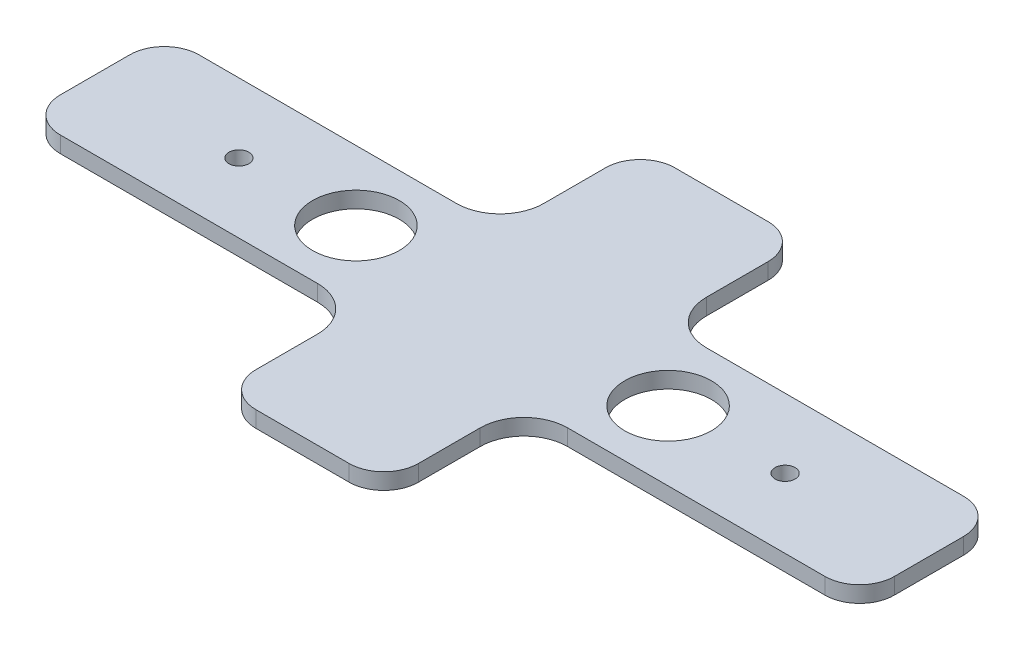
ISO-10303-21;
HEADER;
FILE_DESCRIPTION(('STEP AP214'),'2;1');
FILE_NAME('part.step','',(''),(''),'','','');
FILE_SCHEMA(('AUTOMOTIVE_DESIGN { 1 0 10303 214 1 1 1 1 }'));
ENDSEC;
DATA;
#1=APPLICATION_CONTEXT('core data for automotive mechanical design processes');
#2=APPLICATION_PROTOCOL_DEFINITION('international standard','automotive_design',2000,#1);
#3=PRODUCT_CONTEXT('',#1,'mechanical');
#4=PRODUCT('Part','Part','',(#3));
#5=PRODUCT_RELATED_PRODUCT_CATEGORY('part','',(#4));
#6=PRODUCT_DEFINITION_FORMATION('','',#4);
#7=PRODUCT_DEFINITION_CONTEXT('part definition',#1,'design');
#8=PRODUCT_DEFINITION('design','',#6,#7);
#9=PRODUCT_DEFINITION_SHAPE('','',#8);
#10=(LENGTH_UNIT() NAMED_UNIT(*) SI_UNIT(.MILLI.,.METRE.));
#11=(NAMED_UNIT(*) PLANE_ANGLE_UNIT() SI_UNIT($,.RADIAN.));
#12=(NAMED_UNIT(*) SI_UNIT($,.STERADIAN.) SOLID_ANGLE_UNIT());
#13=UNCERTAINTY_MEASURE_WITH_UNIT(LENGTH_MEASURE(1.E-05),#10,'distance_accuracy_value','');
#14=(GEOMETRIC_REPRESENTATION_CONTEXT(3) GLOBAL_UNCERTAINTY_ASSIGNED_CONTEXT((#13)) GLOBAL_UNIT_ASSIGNED_CONTEXT((#10,
#11,#12)) REPRESENTATION_CONTEXT('',''));
#15=CARTESIAN_POINT('',(0.,0.,0.));
#16=DIRECTION('',(0.,0.,1.));
#17=DIRECTION('',(1.,0.,0.));
#18=AXIS2_PLACEMENT_3D('',#15,#16,#17);
#19=CARTESIAN_POINT('',(0.,90.5002,143.155943707725));
#20=DIRECTION('',(0.,0.,1.));
#21=DIRECTION('',(1.,0.,0.));
#22=AXIS2_PLACEMENT_3D('',#19,#20,#21);
#23=PLANE('',#22);
#24=DIRECTION('',(1.,0.,0.));
#25=VECTOR('',#24,1.);
#26=CARTESIAN_POINT('',(0.,93.472,143.155943707725));
#27=LINE('',#26,#25);
#28=CARTESIAN_POINT('',(-9.32304003720227,93.472,143.155943707725));
#29=VERTEX_POINT('',#28);
#30=CARTESIAN_POINT('',(7.73150051393097,93.472,143.155943707725));
#31=VERTEX_POINT('',#30);
#32=EDGE_CURVE('E275',#29,#31,#27,.T.);
#33=ORIENTED_EDGE('',*,*,#32,.T.);
#34=DIRECTION('',(0.,1.,0.));
#35=VECTOR('',#34,1.);
#36=CARTESIAN_POINT('',(7.73150051393097,90.5002,143.155943707725));
#37=LINE('',#36,#35);
#38=CARTESIAN_POINT('',(7.73150051393097,90.5002,143.155943707725));
#39=VERTEX_POINT('',#38);
#40=EDGE_CURVE('E213',#39,#31,#37,.T.);
#41=ORIENTED_EDGE('',*,*,#40,.F.);
#42=DIRECTION('',(1.,0.,0.));
#43=VECTOR('',#42,1.);
#44=CARTESIAN_POINT('',(0.,90.5002,143.155943707725));
#45=LINE('',#44,#43);
#46=CARTESIAN_POINT('',(-9.32304003720227,90.5002,143.155943707725));
#47=VERTEX_POINT('',#46);
#48=EDGE_CURVE('E212',#47,#39,#45,.T.);
#49=ORIENTED_EDGE('',*,*,#48,.F.);
#50=DIRECTION('',(0.,1.,0.));
#51=VECTOR('',#50,1.);
#52=CARTESIAN_POINT('',(-9.32304003720227,90.5002,143.155943707725));
#53=LINE('',#52,#51);
#54=EDGE_CURVE('E197',#47,#29,#53,.T.);
#55=ORIENTED_EDGE('',*,*,#54,.T.);
#56=EDGE_LOOP('',(#33,#41,#49,#55));
#57=FACE_BOUND('',#56,.T.);
#58=ADVANCED_FACE('F36',(#57),#23,.F.);
#59=CARTESIAN_POINT('',(7.73150051393097,90.5002,149.505943707725));
#60=DIRECTION('',(0.,1.,0.));
#61=DIRECTION('',(0.,0.,1.));
#62=AXIS2_PLACEMENT_3D('',#59,#60,#61);
#63=CYLINDRICAL_SURFACE('',#62,6.35);
#64=CARTESIAN_POINT('',(7.73150051393097,93.472,149.505943707725));
#65=DIRECTION('',(0.,1.,0.));
#66=DIRECTION('',(0.,0.,1.));
#67=AXIS2_PLACEMENT_3D('',#64,#65,#66);
#68=CIRCLE('',#67,6.35);
#69=CARTESIAN_POINT('',(14.081500513931,93.472,149.505943707725));
#70=VERTEX_POINT('',#69);
#71=EDGE_CURVE('E321',#70,#31,#68,.T.);
#72=ORIENTED_EDGE('',*,*,#71,.F.);
#73=DIRECTION('',(0.,1.,0.));
#74=VECTOR('',#73,1.);
#75=CARTESIAN_POINT('',(14.081500513931,90.5002,149.505943707725));
#76=LINE('',#75,#74);
#77=CARTESIAN_POINT('',(14.081500513931,90.5002,149.505943707725));
#78=VERTEX_POINT('',#77);
#79=EDGE_CURVE('E327',#78,#70,#76,.T.);
#80=ORIENTED_EDGE('',*,*,#79,.F.);
#81=CARTESIAN_POINT('',(7.73150051393097,90.5002,149.505943707725));
#82=DIRECTION('',(0.,1.,0.));
#83=DIRECTION('',(0.,0.,1.));
#84=AXIS2_PLACEMENT_3D('',#81,#82,#83);
#85=CIRCLE('',#84,6.35);
#86=EDGE_CURVE('E209',#78,#39,#85,.T.);
#87=ORIENTED_EDGE('',*,*,#86,.T.);
#88=ORIENTED_EDGE('',*,*,#40,.T.);
#89=EDGE_LOOP('',(#72,#80,#87,#88));
#90=FACE_BOUND('',#89,.T.);
#91=ADVANCED_FACE('F437',(#90),#63,.T.);
#92=CARTESIAN_POINT('',(14.081500513931,90.5002,0.));
#93=DIRECTION('',(-1.,0.,0.));
#94=DIRECTION('',(0.,0.,1.));
#95=AXIS2_PLACEMENT_3D('',#92,#93,#94);
#96=PLANE('',#95);
#97=DIRECTION('',(0.,0.,1.));
#98=VECTOR('',#97,1.);
#99=CARTESIAN_POINT('',(14.081500513931,93.472,0.));
#100=LINE('',#99,#98);
#101=CARTESIAN_POINT('',(14.081500513931,93.472,160.805943707725));
#102=VERTEX_POINT('',#101);
#103=EDGE_CURVE('E318',#70,#102,#100,.T.);
#104=ORIENTED_EDGE('',*,*,#103,.T.);
#105=DIRECTION('',(0.,1.,0.));
#106=VECTOR('',#105,1.);
#107=CARTESIAN_POINT('',(14.081500513931,90.5002,160.805943707725));
#108=LINE('',#107,#106);
#109=CARTESIAN_POINT('',(14.081500513931,90.5002,160.805943707725));
#110=VERTEX_POINT('',#109);
#111=EDGE_CURVE('E367',#102,#110,#108,.F.);
#112=ORIENTED_EDGE('',*,*,#111,.T.);
#113=DIRECTION('',(0.,0.,1.));
#114=VECTOR('',#113,1.);
#115=CARTESIAN_POINT('',(14.081500513931,90.5002,0.));
#116=LINE('',#115,#114);
#117=EDGE_CURVE('E264',#78,#110,#116,.T.);
#118=ORIENTED_EDGE('',*,*,#117,.F.);
#119=ORIENTED_EDGE('',*,*,#79,.T.);
#120=EDGE_LOOP('',(#104,#112,#118,#119));
#121=FACE_BOUND('',#120,.T.);
#122=ADVANCED_FACE('F432',(#121),#96,.F.);
#123=CARTESIAN_POINT('',(0.,90.5002,168.805943707725));
#124=DIRECTION('',(0.,0.,1.));
#125=DIRECTION('',(1.,0.,0.));
#126=AXIS2_PLACEMENT_3D('',#123,#124,#125);
#127=PLANE('',#126);
#128=DIRECTION('',(1.,0.,0.));
#129=VECTOR('',#128,1.);
#130=CARTESIAN_POINT('',(0.,90.5002,168.805943707725));
#131=LINE('',#130,#129);
#132=CARTESIAN_POINT('',(22.081500513931,90.5002,168.805943707725));
#133=VERTEX_POINT('',#132);
#134=CARTESIAN_POINT('',(69.2042302383644,90.5002,168.805943707725));
#135=VERTEX_POINT('',#134);
#136=EDGE_CURVE('E262',#133,#135,#131,.T.);
#137=ORIENTED_EDGE('',*,*,#136,.F.);
#138=DIRECTION('',(0.,1.,0.));
#139=VECTOR('',#138,1.);
#140=CARTESIAN_POINT('',(22.081500513931,93.472,168.805943707725));
#141=LINE('',#140,#139);
#142=CARTESIAN_POINT('',(22.081500513931,93.472,168.805943707725));
#143=VERTEX_POINT('',#142);
#144=EDGE_CURVE('E364',#133,#143,#141,.T.);
#145=ORIENTED_EDGE('',*,*,#144,.T.);
#146=DIRECTION('',(1.,0.,0.));
#147=VECTOR('',#146,1.);
#148=CARTESIAN_POINT('',(0.,93.472,168.805943707725));
#149=LINE('',#148,#147);
#150=CARTESIAN_POINT('',(69.2042302383644,93.472,168.805943707725));
#151=VERTEX_POINT('',#150);
#152=EDGE_CURVE('E316',#143,#151,#149,.T.);
#153=ORIENTED_EDGE('',*,*,#152,.T.);
#154=DIRECTION('',(0.,1.,0.));
#155=VECTOR('',#154,1.);
#156=CARTESIAN_POINT('',(69.2042302383644,90.5002,168.805943707725));
#157=LINE('',#156,#155);
#158=EDGE_CURVE('E329',#135,#151,#157,.T.);
#159=ORIENTED_EDGE('',*,*,#158,.F.);
#160=EDGE_LOOP('',(#137,#145,#153,#159));
#161=FACE_BOUND('',#160,.T.);
#162=ADVANCED_FACE('F425',(#161),#127,.F.);
#163=CARTESIAN_POINT('',(69.2042302383644,90.5002,175.155943707725));
#164=DIRECTION('',(0.,1.,0.));
#165=DIRECTION('',(0.,0.,1.));
#166=AXIS2_PLACEMENT_3D('',#163,#164,#165);
#167=CYLINDRICAL_SURFACE('',#166,6.34999999999999);
#168=CARTESIAN_POINT('',(69.2042302383644,93.472,175.155943707725));
#169=DIRECTION('',(0.,1.,0.));
#170=DIRECTION('',(0.,0.,1.));
#171=AXIS2_PLACEMENT_3D('',#168,#169,#170);
#172=CIRCLE('',#171,6.34999999999999);
#173=CARTESIAN_POINT('',(75.5542302383644,93.472,175.155943707725));
#174=VERTEX_POINT('',#173);
#175=EDGE_CURVE('E314',#151,#174,#172,.F.);
#176=ORIENTED_EDGE('',*,*,#175,.T.);
#177=DIRECTION('',(0.,1.,0.));
#178=VECTOR('',#177,1.);
#179=CARTESIAN_POINT('',(75.5542302383644,90.5002,175.155943707725));
#180=LINE('',#179,#178);
#181=CARTESIAN_POINT('',(75.5542302383644,90.5002,175.155943707725));
#182=VERTEX_POINT('',#181);
#183=EDGE_CURVE('E332',#182,#174,#180,.T.);
#184=ORIENTED_EDGE('',*,*,#183,.F.);
#185=CARTESIAN_POINT('',(69.2042302383644,90.5002,175.155943707725));
#186=DIRECTION('',(0.,1.,0.));
#187=DIRECTION('',(0.,0.,1.));
#188=AXIS2_PLACEMENT_3D('',#185,#186,#187);
#189=CIRCLE('',#188,6.34999999999999);
#190=EDGE_CURVE('E260',#135,#182,#189,.F.);
#191=ORIENTED_EDGE('',*,*,#190,.F.);
#192=ORIENTED_EDGE('',*,*,#158,.T.);
#193=EDGE_LOOP('',(#176,#184,#191,#192));
#194=FACE_BOUND('',#193,.T.);
#195=ADVANCED_FACE('F421',(#194),#167,.T.);
#196=CARTESIAN_POINT('',(75.5542302383646,90.5002,0.));
#197=DIRECTION('',(-1.,0.,0.));
#198=DIRECTION('',(0.,0.,1.));
#199=AXIS2_PLACEMENT_3D('',#196,#197,#198);
#200=PLANE('',#199);
#201=DIRECTION('',(0.,0.,1.));
#202=VECTOR('',#201,1.);
#203=CARTESIAN_POINT('',(75.5542302383646,93.472,0.));
#204=LINE('',#203,#202);
#205=CARTESIAN_POINT('',(75.5542302383644,93.472,187.855943707725));
#206=VERTEX_POINT('',#205);
#207=EDGE_CURVE('E312',#174,#206,#204,.T.);
#208=ORIENTED_EDGE('',*,*,#207,.T.);
#209=DIRECTION('',(0.,1.,0.));
#210=VECTOR('',#209,1.);
#211=CARTESIAN_POINT('',(75.5542302383644,90.5002,187.855943707725));
#212=LINE('',#211,#210);
#213=CARTESIAN_POINT('',(75.5542302383644,90.5002,187.855943707725));
#214=VERTEX_POINT('',#213);
#215=EDGE_CURVE('E335',#214,#206,#212,.T.);
#216=ORIENTED_EDGE('',*,*,#215,.F.);
#217=DIRECTION('',(0.,0.,1.));
#218=VECTOR('',#217,1.);
#219=CARTESIAN_POINT('',(75.5542302383646,90.5002,0.));
#220=LINE('',#219,#218);
#221=EDGE_CURVE('E258',#182,#214,#220,.T.);
#222=ORIENTED_EDGE('',*,*,#221,.F.);
#223=ORIENTED_EDGE('',*,*,#183,.T.);
#224=EDGE_LOOP('',(#208,#216,#222,#223));
#225=FACE_BOUND('',#224,.T.);
#226=ADVANCED_FACE('F416',(#225),#200,.F.);
#227=CARTESIAN_POINT('',(69.2042302383644,90.5002,187.855943707725));
#228=DIRECTION('',(0.,1.,0.));
#229=DIRECTION('',(0.,0.,1.));
#230=AXIS2_PLACEMENT_3D('',#227,#228,#229);
#231=CYLINDRICAL_SURFACE('',#230,6.34999999999999);
#232=CARTESIAN_POINT('',(69.2042302383644,93.472,187.855943707725));
#233=DIRECTION('',(0.,1.,0.));
#234=DIRECTION('',(0.,0.,1.));
#235=AXIS2_PLACEMENT_3D('',#232,#233,#234);
#236=CIRCLE('',#235,6.34999999999999);
#237=CARTESIAN_POINT('',(69.2042302383644,93.472,194.205943707725));
#238=VERTEX_POINT('',#237);
#239=EDGE_CURVE('E310',#206,#238,#236,.F.);
#240=ORIENTED_EDGE('',*,*,#239,.T.);
#241=DIRECTION('',(0.,1.,0.));
#242=VECTOR('',#241,1.);
#243=CARTESIAN_POINT('',(69.2042302383644,90.5002,194.205943707725));
#244=LINE('',#243,#242);
#245=CARTESIAN_POINT('',(69.2042302383644,90.5002,194.205943707725));
#246=VERTEX_POINT('',#245);
#247=EDGE_CURVE('E338',#246,#238,#244,.T.);
#248=ORIENTED_EDGE('',*,*,#247,.F.);
#249=CARTESIAN_POINT('',(69.2042302383644,90.5002,187.855943707725));
#250=DIRECTION('',(0.,1.,0.));
#251=DIRECTION('',(0.,0.,1.));
#252=AXIS2_PLACEMENT_3D('',#249,#250,#251);
#253=CIRCLE('',#252,6.34999999999999);
#254=EDGE_CURVE('E256',#214,#246,#253,.F.);
#255=ORIENTED_EDGE('',*,*,#254,.F.);
#256=ORIENTED_EDGE('',*,*,#215,.T.);
#257=EDGE_LOOP('',(#240,#248,#255,#256));
#258=FACE_BOUND('',#257,.T.);
#259=ADVANCED_FACE('F410',(#258),#231,.T.);
#260=CARTESIAN_POINT('',(0.,90.5002,194.205943707725));
#261=DIRECTION('',(0.,0.,-1.));
#262=DIRECTION('',(-1.,0.,0.));
#263=AXIS2_PLACEMENT_3D('',#260,#261,#262);
#264=PLANE('',#263);
#265=DIRECTION('',(-1.,0.,0.));
#266=VECTOR('',#265,1.);
#267=CARTESIAN_POINT('',(0.,93.472,194.205943707725));
#268=LINE('',#267,#266);
#269=CARTESIAN_POINT('',(22.081500513931,93.472,194.205943707725));
#270=VERTEX_POINT('',#269);
#271=EDGE_CURVE('E307',#238,#270,#268,.T.);
#272=ORIENTED_EDGE('',*,*,#271,.T.);
#273=DIRECTION('',(0.,1.,0.));
#274=VECTOR('',#273,1.);
#275=CARTESIAN_POINT('',(22.081500513931,90.5002,194.205943707725));
#276=LINE('',#275,#274);
#277=CARTESIAN_POINT('',(22.081500513931,90.5002,194.205943707725));
#278=VERTEX_POINT('',#277);
#279=EDGE_CURVE('E372',#270,#278,#276,.F.);
#280=ORIENTED_EDGE('',*,*,#279,.T.);
#281=DIRECTION('',(-1.,0.,0.));
#282=VECTOR('',#281,1.);
#283=CARTESIAN_POINT('',(0.,90.5002,194.205943707725));
#284=LINE('',#283,#282);
#285=EDGE_CURVE('E253',#246,#278,#284,.T.);
#286=ORIENTED_EDGE('',*,*,#285,.F.);
#287=ORIENTED_EDGE('',*,*,#247,.T.);
#288=EDGE_LOOP('',(#272,#280,#286,#287));
#289=FACE_BOUND('',#288,.T.);
#290=ADVANCED_FACE('F406',(#289),#264,.F.);
#291=CARTESIAN_POINT('',(14.0815005139309,90.5002,0.));
#292=DIRECTION('',(-1.,0.,0.));
#293=DIRECTION('',(0.,0.,1.));
#294=AXIS2_PLACEMENT_3D('',#291,#292,#293);
#295=PLANE('',#294);
#296=DIRECTION('',(0.,0.,1.));
#297=VECTOR('',#296,1.);
#298=CARTESIAN_POINT('',(14.0815005139309,90.5002,0.));
#299=LINE('',#298,#297);
#300=CARTESIAN_POINT('',(14.081500513931,90.5002,202.205943707725));
#301=VERTEX_POINT('',#300);
#302=CARTESIAN_POINT('',(14.081500513931,90.5002,213.505943707725));
#303=VERTEX_POINT('',#302);
#304=EDGE_CURVE('E251',#301,#303,#299,.T.);
#305=ORIENTED_EDGE('',*,*,#304,.F.);
#306=DIRECTION('',(0.,1.,0.));
#307=VECTOR('',#306,1.);
#308=CARTESIAN_POINT('',(14.081500513931,93.472,202.205943707725));
#309=LINE('',#308,#307);
#310=CARTESIAN_POINT('',(14.081500513931,93.472,202.205943707725));
#311=VERTEX_POINT('',#310);
#312=EDGE_CURVE('E369',#301,#311,#309,.T.);
#313=ORIENTED_EDGE('',*,*,#312,.T.);
#314=DIRECTION('',(0.,0.,1.));
#315=VECTOR('',#314,1.);
#316=CARTESIAN_POINT('',(14.0815005139309,93.472,0.));
#317=LINE('',#316,#315);
#318=CARTESIAN_POINT('',(14.081500513931,93.472,213.505943707725));
#319=VERTEX_POINT('',#318);
#320=EDGE_CURVE('E305',#311,#319,#317,.T.);
#321=ORIENTED_EDGE('',*,*,#320,.T.);
#322=DIRECTION('',(0.,1.,0.));
#323=VECTOR('',#322,1.);
#324=CARTESIAN_POINT('',(14.081500513931,90.5002,213.505943707725));
#325=LINE('',#324,#323);
#326=EDGE_CURVE('E341',#303,#319,#325,.T.);
#327=ORIENTED_EDGE('',*,*,#326,.F.);
#328=EDGE_LOOP('',(#305,#313,#321,#327));
#329=FACE_BOUND('',#328,.T.);
#330=ADVANCED_FACE('F397',(#329),#295,.F.);
#331=CARTESIAN_POINT('',(7.73150051393097,90.5002,213.505943707725));
#332=DIRECTION('',(0.,1.,0.));
#333=DIRECTION('',(0.,0.,1.));
#334=AXIS2_PLACEMENT_3D('',#331,#332,#333);
#335=CYLINDRICAL_SURFACE('',#334,6.35);
#336=CARTESIAN_POINT('',(7.73150051393097,93.472,213.505943707725));
#337=DIRECTION('',(0.,1.,0.));
#338=DIRECTION('',(0.,0.,1.));
#339=AXIS2_PLACEMENT_3D('',#336,#337,#338);
#340=CIRCLE('',#339,6.35);
#341=CARTESIAN_POINT('',(7.73150051393097,93.472,219.855943707725));
#342=VERTEX_POINT('',#341);
#343=EDGE_CURVE('E302',#319,#342,#340,.F.);
#344=ORIENTED_EDGE('',*,*,#343,.T.);
#345=DIRECTION('',(0.,1.,0.));
#346=VECTOR('',#345,1.);
#347=CARTESIAN_POINT('',(7.73150051393097,90.5002,219.855943707725));
#348=LINE('',#347,#346);
#349=CARTESIAN_POINT('',(7.73150051393097,90.5002,219.855943707725));
#350=VERTEX_POINT('',#349);
#351=EDGE_CURVE('E344',#350,#342,#348,.T.);
#352=ORIENTED_EDGE('',*,*,#351,.F.);
#353=CARTESIAN_POINT('',(7.73150051393097,90.5002,213.505943707725));
#354=DIRECTION('',(0.,1.,0.));
#355=DIRECTION('',(0.,0.,1.));
#356=AXIS2_PLACEMENT_3D('',#353,#354,#355);
#357=CIRCLE('',#356,6.35);
#358=EDGE_CURVE('E249',#303,#350,#357,.F.);
#359=ORIENTED_EDGE('',*,*,#358,.F.);
#360=ORIENTED_EDGE('',*,*,#326,.T.);
#361=EDGE_LOOP('',(#344,#352,#359,#360));
#362=FACE_BOUND('',#361,.T.);
#363=ADVANCED_FACE('F480',(#362),#335,.T.);
#364=CARTESIAN_POINT('',(0.,90.5002,219.855943707725));
#365=DIRECTION('',(0.,0.,1.));
#366=DIRECTION('',(1.,0.,0.));
#367=AXIS2_PLACEMENT_3D('',#364,#365,#366);
#368=PLANE('',#367);
#369=DIRECTION('',(1.,0.,0.));
#370=VECTOR('',#369,1.);
#371=CARTESIAN_POINT('',(0.,93.472,219.855943707725));
#372=LINE('',#371,#370);
#373=CARTESIAN_POINT('',(-9.32304003720227,93.472,219.855943707725));
#374=VERTEX_POINT('',#373);
#375=EDGE_CURVE('E299',#374,#342,#372,.T.);
#376=ORIENTED_EDGE('',*,*,#375,.F.);
#377=DIRECTION('',(0.,1.,0.));
#378=VECTOR('',#377,1.);
#379=CARTESIAN_POINT('',(-9.32304003720227,90.5002,219.855943707725));
#380=LINE('',#379,#378);
#381=CARTESIAN_POINT('',(-9.32304003720227,90.5002,219.855943707725));
#382=VERTEX_POINT('',#381);
#383=EDGE_CURVE('E346',#382,#374,#380,.T.);
#384=ORIENTED_EDGE('',*,*,#383,.F.);
#385=DIRECTION('',(1.,0.,0.));
#386=VECTOR('',#385,1.);
#387=CARTESIAN_POINT('',(0.,90.5002,219.855943707725));
#388=LINE('',#387,#386);
#389=EDGE_CURVE('E246',#382,#350,#388,.T.);
#390=ORIENTED_EDGE('',*,*,#389,.T.);
#391=ORIENTED_EDGE('',*,*,#351,.T.);
#392=EDGE_LOOP('',(#376,#384,#390,#391));
#393=FACE_BOUND('',#392,.T.);
#394=ADVANCED_FACE('F477',(#393),#368,.T.);
#395=CARTESIAN_POINT('',(-9.32304003720227,90.5002,213.505943707725));
#396=DIRECTION('',(0.,1.,0.));
#397=DIRECTION('',(0.,0.,1.));
#398=AXIS2_PLACEMENT_3D('',#395,#396,#397);
#399=CYLINDRICAL_SURFACE('',#398,6.35);
#400=CARTESIAN_POINT('',(-9.32304003720227,93.472,213.505943707725));
#401=DIRECTION('',(0.,1.,0.));
#402=DIRECTION('',(0.,0.,1.));
#403=AXIS2_PLACEMENT_3D('',#400,#401,#402);
#404=CIRCLE('',#403,6.35);
#405=CARTESIAN_POINT('',(-15.6730400372023,93.472,213.505943707725));
#406=VERTEX_POINT('',#405);
#407=EDGE_CURVE('E296',#406,#374,#404,.T.);
#408=ORIENTED_EDGE('',*,*,#407,.F.);
#409=DIRECTION('',(0.,1.,0.));
#410=VECTOR('',#409,1.);
#411=CARTESIAN_POINT('',(-15.6730400372023,90.5002,213.505943707725));
#412=LINE('',#411,#410);
#413=CARTESIAN_POINT('',(-15.6730400372023,90.5002,213.505943707725));
#414=VERTEX_POINT('',#413);
#415=EDGE_CURVE('E348',#414,#406,#412,.T.);
#416=ORIENTED_EDGE('',*,*,#415,.F.);
#417=CARTESIAN_POINT('',(-9.32304003720227,90.5002,213.505943707725));
#418=DIRECTION('',(0.,1.,0.));
#419=DIRECTION('',(0.,0.,1.));
#420=AXIS2_PLACEMENT_3D('',#417,#418,#419);
#421=CIRCLE('',#420,6.35);
#422=EDGE_CURVE('E243',#414,#382,#421,.T.);
#423=ORIENTED_EDGE('',*,*,#422,.T.);
#424=ORIENTED_EDGE('',*,*,#383,.T.);
#425=EDGE_LOOP('',(#408,#416,#423,#424));
#426=FACE_BOUND('',#425,.T.);
#427=ADVANCED_FACE('F474',(#426),#399,.T.);
#428=CARTESIAN_POINT('',(-15.6730400372023,90.5002,0.));
#429=DIRECTION('',(1.,0.,0.));
#430=DIRECTION('',(0.,0.,-1.));
#431=AXIS2_PLACEMENT_3D('',#428,#429,#430);
#432=PLANE('',#431);
#433=DIRECTION('',(0.,0.,-1.));
#434=VECTOR('',#433,1.);
#435=CARTESIAN_POINT('',(-15.6730400372023,93.472,0.));
#436=LINE('',#435,#434);
#437=CARTESIAN_POINT('',(-15.6730400372023,93.472,202.205943707725));
#438=VERTEX_POINT('',#437);
#439=EDGE_CURVE('E294',#406,#438,#436,.T.);
#440=ORIENTED_EDGE('',*,*,#439,.T.);
#441=DIRECTION('',(0.,1.,0.));
#442=VECTOR('',#441,1.);
#443=CARTESIAN_POINT('',(-15.6730400372023,90.5002,202.205943707725));
#444=LINE('',#443,#442);
#445=CARTESIAN_POINT('',(-15.6730400372023,90.5002,202.205943707725));
#446=VERTEX_POINT('',#445);
#447=EDGE_CURVE('E51',#438,#446,#444,.F.);
#448=ORIENTED_EDGE('',*,*,#447,.T.);
#449=DIRECTION('',(0.,0.,-1.));
#450=VECTOR('',#449,1.);
#451=CARTESIAN_POINT('',(-15.6730400372023,90.5002,0.));
#452=LINE('',#451,#450);
#453=EDGE_CURVE('E241',#414,#446,#452,.T.);
#454=ORIENTED_EDGE('',*,*,#453,.F.);
#455=ORIENTED_EDGE('',*,*,#415,.T.);
#456=EDGE_LOOP('',(#440,#448,#454,#455));
#457=FACE_BOUND('',#456,.T.);
#458=ADVANCED_FACE('F471',(#457),#432,.F.);
#459=CARTESIAN_POINT('',(0.,90.5002,194.205943707725));
#460=DIRECTION('',(0.,0.,-1.));
#461=DIRECTION('',(-1.,0.,0.));
#462=AXIS2_PLACEMENT_3D('',#459,#460,#461);
#463=PLANE('',#462);
#464=DIRECTION('',(-1.,0.,0.));
#465=VECTOR('',#464,1.);
#466=CARTESIAN_POINT('',(0.,90.5002,194.205943707725));
#467=LINE('',#466,#465);
#468=CARTESIAN_POINT('',(-23.6730400372023,90.5002,194.205943707725));
#469=VERTEX_POINT('',#468);
#470=CARTESIAN_POINT('',(-70.7957697616356,90.5002,194.205943707725));
#471=VERTEX_POINT('',#470);
#472=EDGE_CURVE('E239',#469,#471,#467,.T.);
#473=ORIENTED_EDGE('',*,*,#472,.F.);
#474=DIRECTION('',(0.,1.,0.));
#475=VECTOR('',#474,1.);
#476=CARTESIAN_POINT('',(-23.6730400372023,93.472,194.205943707725));
#477=LINE('',#476,#475);
#478=CARTESIAN_POINT('',(-23.6730400372023,93.472,194.205943707725));
#479=VERTEX_POINT('',#478);
#480=EDGE_CURVE('E374',#469,#479,#477,.T.);
#481=ORIENTED_EDGE('',*,*,#480,.T.);
#482=DIRECTION('',(-1.,0.,0.));
#483=VECTOR('',#482,1.);
#484=CARTESIAN_POINT('',(0.,93.472,194.205943707725));
#485=LINE('',#484,#483);
#486=CARTESIAN_POINT('',(-70.7957697616356,93.472,194.205943707725));
#487=VERTEX_POINT('',#486);
#488=EDGE_CURVE('E292',#479,#487,#485,.T.);
#489=ORIENTED_EDGE('',*,*,#488,.T.);
#490=DIRECTION('',(0.,1.,0.));
#491=VECTOR('',#490,1.);
#492=CARTESIAN_POINT('',(-70.7957697616356,90.5002,194.205943707725));
#493=LINE('',#492,#491);
#494=EDGE_CURVE('E350',#471,#487,#493,.T.);
#495=ORIENTED_EDGE('',*,*,#494,.F.);
#496=EDGE_LOOP('',(#473,#481,#489,#495));
#497=FACE_BOUND('',#496,.T.);
#498=ADVANCED_FACE('F465',(#497),#463,.F.);
#499=CARTESIAN_POINT('',(-70.7957697616356,90.5002,187.855943707725));
#500=DIRECTION('',(0.,1.,0.));
#501=DIRECTION('',(0.,0.,1.));
#502=AXIS2_PLACEMENT_3D('',#499,#500,#501);
#503=CYLINDRICAL_SURFACE('',#502,6.34999999999999);
#504=CARTESIAN_POINT('',(-70.7957697616356,93.472,187.855943707725));
#505=DIRECTION('',(0.,1.,0.));
#506=DIRECTION('',(0.,0.,1.));
#507=AXIS2_PLACEMENT_3D('',#504,#505,#506);
#508=CIRCLE('',#507,6.34999999999999);
#509=CARTESIAN_POINT('',(-77.1457697616356,93.472,187.855943707725));
#510=VERTEX_POINT('',#509);
#511=EDGE_CURVE('E289',#510,#487,#508,.T.);
#512=ORIENTED_EDGE('',*,*,#511,.F.);
#513=DIRECTION('',(0.,1.,0.));
#514=VECTOR('',#513,1.);
#515=CARTESIAN_POINT('',(-77.1457697616356,90.5002,187.855943707725));
#516=LINE('',#515,#514);
#517=CARTESIAN_POINT('',(-77.1457697616356,90.5002,187.855943707725));
#518=VERTEX_POINT('',#517);
#519=EDGE_CURVE('E353',#518,#510,#516,.T.);
#520=ORIENTED_EDGE('',*,*,#519,.F.);
#521=CARTESIAN_POINT('',(-70.7957697616356,90.5002,187.855943707725));
#522=DIRECTION('',(0.,1.,0.));
#523=DIRECTION('',(0.,0.,1.));
#524=AXIS2_PLACEMENT_3D('',#521,#522,#523);
#525=CIRCLE('',#524,6.34999999999999);
#526=EDGE_CURVE('E236',#518,#471,#525,.T.);
#527=ORIENTED_EDGE('',*,*,#526,.T.);
#528=ORIENTED_EDGE('',*,*,#494,.T.);
#529=EDGE_LOOP('',(#512,#520,#527,#528));
#530=FACE_BOUND('',#529,.T.);
#531=ADVANCED_FACE('F461',(#530),#503,.T.);
#532=CARTESIAN_POINT('',(-77.1457697616356,90.5002,0.));
#533=DIRECTION('',(-1.,0.,0.));
#534=DIRECTION('',(0.,0.,1.));
#535=AXIS2_PLACEMENT_3D('',#532,#533,#534);
#536=PLANE('',#535);
#537=DIRECTION('',(0.,0.,1.));
#538=VECTOR('',#537,1.);
#539=CARTESIAN_POINT('',(-77.1457697616356,93.472,0.));
#540=LINE('',#539,#538);
#541=CARTESIAN_POINT('',(-77.1457697616356,93.472,175.155943707725));
#542=VERTEX_POINT('',#541);
#543=EDGE_CURVE('E286',#542,#510,#540,.T.);
#544=ORIENTED_EDGE('',*,*,#543,.F.);
#545=DIRECTION('',(0.,1.,0.));
#546=VECTOR('',#545,1.);
#547=CARTESIAN_POINT('',(-77.1457697616356,90.5002,175.155943707725));
#548=LINE('',#547,#546);
#549=CARTESIAN_POINT('',(-77.1457697616356,90.5002,175.155943707725));
#550=VERTEX_POINT('',#549);
#551=EDGE_CURVE('E355',#550,#542,#548,.T.);
#552=ORIENTED_EDGE('',*,*,#551,.F.);
#553=DIRECTION('',(0.,0.,1.));
#554=VECTOR('',#553,1.);
#555=CARTESIAN_POINT('',(-77.1457697616356,90.5002,0.));
#556=LINE('',#555,#554);
#557=EDGE_CURVE('E233',#550,#518,#556,.T.);
#558=ORIENTED_EDGE('',*,*,#557,.T.);
#559=ORIENTED_EDGE('',*,*,#519,.T.);
#560=EDGE_LOOP('',(#544,#552,#558,#559));
#561=FACE_BOUND('',#560,.T.);
#562=ADVANCED_FACE('F459',(#561),#536,.T.);
#563=CARTESIAN_POINT('',(-70.7957697616356,90.5002,175.155943707725));
#564=DIRECTION('',(0.,1.,0.));
#565=DIRECTION('',(0.,0.,1.));
#566=AXIS2_PLACEMENT_3D('',#563,#564,#565);
#567=CYLINDRICAL_SURFACE('',#566,6.34999999999999);
#568=CARTESIAN_POINT('',(-70.7957697616356,93.472,175.155943707725));
#569=DIRECTION('',(0.,1.,0.));
#570=DIRECTION('',(0.,0.,1.));
#571=AXIS2_PLACEMENT_3D('',#568,#569,#570);
#572=CIRCLE('',#571,6.34999999999999);
#573=CARTESIAN_POINT('',(-70.7957697616356,93.472,168.805943707725));
#574=VERTEX_POINT('',#573);
#575=EDGE_CURVE('E283',#574,#542,#572,.T.);
#576=ORIENTED_EDGE('',*,*,#575,.F.);
#577=DIRECTION('',(0.,1.,0.));
#578=VECTOR('',#577,1.);
#579=CARTESIAN_POINT('',(-70.7957697616356,90.5002,168.805943707725));
#580=LINE('',#579,#578);
#581=CARTESIAN_POINT('',(-70.7957697616356,90.5002,168.805943707725));
#582=VERTEX_POINT('',#581);
#583=EDGE_CURVE('E357',#582,#574,#580,.T.);
#584=ORIENTED_EDGE('',*,*,#583,.F.);
#585=CARTESIAN_POINT('',(-70.7957697616356,90.5002,175.155943707725));
#586=DIRECTION('',(0.,1.,0.));
#587=DIRECTION('',(0.,0.,1.));
#588=AXIS2_PLACEMENT_3D('',#585,#586,#587);
#589=CIRCLE('',#588,6.34999999999999);
#590=EDGE_CURVE('E230',#582,#550,#589,.T.);
#591=ORIENTED_EDGE('',*,*,#590,.T.);
#592=ORIENTED_EDGE('',*,*,#551,.T.);
#593=EDGE_LOOP('',(#576,#584,#591,#592));
#594=FACE_BOUND('',#593,.T.);
#595=ADVANCED_FACE('F455',(#594),#567,.T.);
#596=CARTESIAN_POINT('',(0.,90.5002,168.805943707725));
#597=DIRECTION('',(0.,0.,1.));
#598=DIRECTION('',(1.,0.,0.));
#599=AXIS2_PLACEMENT_3D('',#596,#597,#598);
#600=PLANE('',#599);
#601=DIRECTION('',(1.,0.,0.));
#602=VECTOR('',#601,1.);
#603=CARTESIAN_POINT('',(0.,93.472,168.805943707725));
#604=LINE('',#603,#602);
#605=CARTESIAN_POINT('',(-23.6730400372023,93.472,168.805943707725));
#606=VERTEX_POINT('',#605);
#607=EDGE_CURVE('E280',#574,#606,#604,.T.);
#608=ORIENTED_EDGE('',*,*,#607,.T.);
#609=DIRECTION('',(0.,1.,0.));
#610=VECTOR('',#609,1.);
#611=CARTESIAN_POINT('',(-23.6730400372023,90.5002,168.805943707725));
#612=LINE('',#611,#610);
#613=CARTESIAN_POINT('',(-23.6730400372023,90.5002,168.805943707725));
#614=VERTEX_POINT('',#613);
#615=EDGE_CURVE('E362',#606,#614,#612,.F.);
#616=ORIENTED_EDGE('',*,*,#615,.T.);
#617=DIRECTION('',(1.,0.,0.));
#618=VECTOR('',#617,1.);
#619=CARTESIAN_POINT('',(0.,90.5002,168.805943707725));
#620=LINE('',#619,#618);
#621=EDGE_CURVE('E224',#582,#614,#620,.T.);
#622=ORIENTED_EDGE('',*,*,#621,.F.);
#623=ORIENTED_EDGE('',*,*,#583,.T.);
#624=EDGE_LOOP('',(#608,#616,#622,#623));
#625=FACE_BOUND('',#624,.T.);
#626=ADVANCED_FACE('F449',(#625),#600,.F.);
#627=CARTESIAN_POINT('',(-15.6730400372023,90.5002,0.));
#628=DIRECTION('',(1.,0.,0.));
#629=DIRECTION('',(0.,0.,-1.));
#630=AXIS2_PLACEMENT_3D('',#627,#628,#629);
#631=PLANE('',#630);
#632=DIRECTION('',(0.,0.,-1.));
#633=VECTOR('',#632,1.);
#634=CARTESIAN_POINT('',(-15.6730400372023,90.5002,0.));
#635=LINE('',#634,#633);
#636=CARTESIAN_POINT('',(-15.6730400372023,90.5002,160.805943707725));
#637=VERTEX_POINT('',#636);
#638=CARTESIAN_POINT('',(-15.6730400372023,90.5002,149.505943707725));
#639=VERTEX_POINT('',#638);
#640=EDGE_CURVE('E221',#637,#639,#635,.T.);
#641=ORIENTED_EDGE('',*,*,#640,.F.);
#642=DIRECTION('',(0.,1.,0.));
#643=VECTOR('',#642,1.);
#644=CARTESIAN_POINT('',(-15.6730400372023,93.472,160.805943707725));
#645=LINE('',#644,#643);
#646=CARTESIAN_POINT('',(-15.6730400372023,93.472,160.805943707725));
#647=VERTEX_POINT('',#646);
#648=EDGE_CURVE('E326',#637,#647,#645,.T.);
#649=ORIENTED_EDGE('',*,*,#648,.T.);
#650=DIRECTION('',(0.,0.,-1.));
#651=VECTOR('',#650,1.);
#652=CARTESIAN_POINT('',(-15.6730400372023,93.472,0.));
#653=LINE('',#652,#651);
#654=CARTESIAN_POINT('',(-15.6730400372023,93.472,149.505943707725));
#655=VERTEX_POINT('',#654);
#656=EDGE_CURVE('E278',#647,#655,#653,.T.);
#657=ORIENTED_EDGE('',*,*,#656,.T.);
#658=DIRECTION('',(0.,1.,0.));
#659=VECTOR('',#658,1.);
#660=CARTESIAN_POINT('',(-15.6730400372023,90.5002,149.505943707725));
#661=LINE('',#660,#659);
#662=EDGE_CURVE('E208',#639,#655,#661,.T.);
#663=ORIENTED_EDGE('',*,*,#662,.F.);
#664=EDGE_LOOP('',(#641,#649,#657,#663));
#665=FACE_BOUND('',#664,.T.);
#666=ADVANCED_FACE('F441',(#665),#631,.F.);
#667=CARTESIAN_POINT('',(-29.3707697616357,90.5002,181.505943707726));
#668=DIRECTION('',(0.,1.,0.));
#669=DIRECTION('',(0.,0.,1.));
#670=AXIS2_PLACEMENT_3D('',#667,#668,#669);
#671=CYLINDRICAL_SURFACE('',#670,7.93749999999996);
#672=CARTESIAN_POINT('',(-29.3707697616357,90.5002,181.505943707726));
#673=DIRECTION('',(0.,1.,0.));
#674=DIRECTION('',(0.,0.,1.));
#675=AXIS2_PLACEMENT_3D('',#672,#673,#674);
#676=CIRCLE('',#675,7.93749999999996);
#677=CARTESIAN_POINT('',(-29.3707697616357,90.5002,189.443443707726));
#678=VERTEX_POINT('',#677);
#679=EDGE_CURVE('E217',#678,#678,#676,.T.);
#680=ORIENTED_EDGE('',*,*,#679,.F.);
#681=EDGE_LOOP('',(#680));
#682=FACE_BOUND('',#681,.T.);
#683=CARTESIAN_POINT('',(-29.3707697616357,93.472,181.505943707726));
#684=DIRECTION('',(0.,1.,0.));
#685=DIRECTION('',(0.,0.,1.));
#686=AXIS2_PLACEMENT_3D('',#683,#684,#685);
#687=CIRCLE('',#686,7.93749999999996);
#688=CARTESIAN_POINT('',(-29.3707697616357,93.472,189.443443707726));
#689=VERTEX_POINT('',#688);
#690=EDGE_CURVE('E271',#689,#689,#687,.T.);
#691=ORIENTED_EDGE('',*,*,#690,.T.);
#692=EDGE_LOOP('',(#691));
#693=FACE_BOUND('',#692,.T.);
#694=ADVANCED_FACE('F498',(#682,#693),#671,.F.);
#695=CARTESIAN_POINT('',(27.7792302383642,90.5002,181.505943707726));
#696=DIRECTION('',(0.,1.,0.));
#697=DIRECTION('',(0.,0.,1.));
#698=AXIS2_PLACEMENT_3D('',#695,#696,#697);
#699=CYLINDRICAL_SURFACE('',#698,7.93750000000001);
#700=CARTESIAN_POINT('',(27.7792302383642,90.5002,181.505943707726));
#701=DIRECTION('',(0.,1.,0.));
#702=DIRECTION('',(0.,0.,1.));
#703=AXIS2_PLACEMENT_3D('',#700,#701,#702);
#704=CIRCLE('',#703,7.93750000000001);
#705=CARTESIAN_POINT('',(27.7792302383642,90.5002,189.443443707726));
#706=VERTEX_POINT('',#705);
#707=EDGE_CURVE('E324',#706,#706,#704,.T.);
#708=ORIENTED_EDGE('',*,*,#707,.F.);
#709=EDGE_LOOP('',(#708));
#710=FACE_BOUND('',#709,.T.);
#711=CARTESIAN_POINT('',(27.7792302383642,93.472,181.505943707726));
#712=DIRECTION('',(0.,1.,0.));
#713=DIRECTION('',(0.,0.,1.));
#714=AXIS2_PLACEMENT_3D('',#711,#712,#713);
#715=CIRCLE('',#714,7.93750000000001);
#716=CARTESIAN_POINT('',(27.7792302383642,93.472,189.443443707726));
#717=VERTEX_POINT('',#716);
#718=EDGE_CURVE('E268',#717,#717,#715,.T.);
#719=ORIENTED_EDGE('',*,*,#718,.T.);
#720=EDGE_LOOP('',(#719));
#721=FACE_BOUND('',#720,.T.);
#722=ADVANCED_FACE('F501',(#710,#721),#699,.F.);
#723=CARTESIAN_POINT('',(-9.32304003720227,90.5002,149.505943707725));
#724=DIRECTION('',(0.,1.,0.));
#725=DIRECTION('',(0.,0.,1.));
#726=AXIS2_PLACEMENT_3D('',#723,#724,#725);
#727=CYLINDRICAL_SURFACE('',#726,6.35);
#728=CARTESIAN_POINT('',(-9.32304003720227,93.472,149.505943707725));
#729=DIRECTION('',(0.,1.,0.));
#730=DIRECTION('',(0.,0.,1.));
#731=AXIS2_PLACEMENT_3D('',#728,#729,#730);
#732=CIRCLE('',#731,6.35);
#733=EDGE_CURVE('E204',#29,#655,#732,.T.);
#734=ORIENTED_EDGE('',*,*,#733,.F.);
#735=ORIENTED_EDGE('',*,*,#54,.F.);
#736=CARTESIAN_POINT('',(-9.32304003720227,90.5002,149.505943707725));
#737=DIRECTION('',(0.,1.,0.));
#738=DIRECTION('',(0.,0.,1.));
#739=AXIS2_PLACEMENT_3D('',#736,#737,#738);
#740=CIRCLE('',#739,6.35);
#741=EDGE_CURVE('E202',#47,#639,#740,.T.);
#742=ORIENTED_EDGE('',*,*,#741,.T.);
#743=ORIENTED_EDGE('',*,*,#662,.T.);
#744=EDGE_LOOP('',(#734,#735,#742,#743));
#745=FACE_BOUND('',#744,.T.);
#746=ADVANCED_FACE('F199',(#745),#727,.T.);
#747=CARTESIAN_POINT('',(0.,90.5002,0.));
#748=DIRECTION('',(0.,1.,0.));
#749=DIRECTION('',(0.,0.,1.));
#750=AXIS2_PLACEMENT_3D('',#747,#748,#749);
#751=PLANE('',#750);
#752=CARTESIAN_POINT('',(49.2042302383644,90.5002,181.505943707725));
#753=DIRECTION('',(0.,1.,0.));
#754=DIRECTION('',(0.,0.,1.));
#755=AXIS2_PLACEMENT_3D('',#752,#753,#754);
#756=CIRCLE('',#755,1.8288);
#757=CARTESIAN_POINT('',(49.2042302383644,90.5002,183.334743707725));
#758=VERTEX_POINT('',#757);
#759=EDGE_CURVE('E272',#758,#758,#756,.T.);
#760=ORIENTED_EDGE('',*,*,#759,.T.);
#761=EDGE_LOOP('',(#760));
#762=FACE_BOUND('',#761,.T.);
#763=CARTESIAN_POINT('',(-50.7957697616357,90.5002,181.505943707725));
#764=DIRECTION('',(0.,1.,0.));
#765=DIRECTION('',(0.,0.,1.));
#766=AXIS2_PLACEMENT_3D('',#763,#764,#765);
#767=CIRCLE('',#766,1.8288);
#768=CARTESIAN_POINT('',(-50.7957697616357,90.5002,183.334743707725));
#769=VERTEX_POINT('',#768);
#770=EDGE_CURVE('E744',#769,#769,#767,.T.);
#771=ORIENTED_EDGE('',*,*,#770,.T.);
#772=EDGE_LOOP('',(#771));
#773=FACE_BOUND('',#772,.T.);
#774=ORIENTED_EDGE('',*,*,#707,.T.);
#775=EDGE_LOOP('',(#774));
#776=FACE_BOUND('',#775,.T.);
#777=ORIENTED_EDGE('',*,*,#679,.T.);
#778=EDGE_LOOP('',(#777));
#779=FACE_BOUND('',#778,.T.);
#780=ORIENTED_EDGE('',*,*,#48,.T.);
#781=ORIENTED_EDGE('',*,*,#86,.F.);
#782=ORIENTED_EDGE('',*,*,#117,.T.);
#783=CARTESIAN_POINT('',(22.081500513931,90.5002,160.805943707725));
#784=DIRECTION('',(0.,1.,0.));
#785=DIRECTION('',(0.,0.,1.));
#786=AXIS2_PLACEMENT_3D('',#783,#784,#785);
#787=CIRCLE('',#786,8.);
#788=EDGE_CURVE('E384',#110,#133,#787,.T.);
#789=ORIENTED_EDGE('',*,*,#788,.T.);
#790=ORIENTED_EDGE('',*,*,#136,.T.);
#791=ORIENTED_EDGE('',*,*,#190,.T.);
#792=ORIENTED_EDGE('',*,*,#221,.T.);
#793=ORIENTED_EDGE('',*,*,#254,.T.);
#794=ORIENTED_EDGE('',*,*,#285,.T.);
#795=CARTESIAN_POINT('',(22.081500513931,90.5002,202.205943707725));
#796=DIRECTION('',(0.,1.,0.));
#797=DIRECTION('',(0.,0.,1.));
#798=AXIS2_PLACEMENT_3D('',#795,#796,#797);
#799=CIRCLE('',#798,8.);
#800=EDGE_CURVE('E388',#278,#301,#799,.T.);
#801=ORIENTED_EDGE('',*,*,#800,.T.);
#802=ORIENTED_EDGE('',*,*,#304,.T.);
#803=ORIENTED_EDGE('',*,*,#358,.T.);
#804=ORIENTED_EDGE('',*,*,#389,.F.);
#805=ORIENTED_EDGE('',*,*,#422,.F.);
#806=ORIENTED_EDGE('',*,*,#453,.T.);
#807=CARTESIAN_POINT('',(-23.6730400372023,90.5002,202.205943707725));
#808=DIRECTION('',(0.,1.,0.));
#809=DIRECTION('',(0.,0.,1.));
#810=AXIS2_PLACEMENT_3D('',#807,#808,#809);
#811=CIRCLE('',#810,8.);
#812=EDGE_CURVE('E11',#446,#469,#811,.T.);
#813=ORIENTED_EDGE('',*,*,#812,.T.);
#814=ORIENTED_EDGE('',*,*,#472,.T.);
#815=ORIENTED_EDGE('',*,*,#526,.F.);
#816=ORIENTED_EDGE('',*,*,#557,.F.);
#817=ORIENTED_EDGE('',*,*,#590,.F.);
#818=ORIENTED_EDGE('',*,*,#621,.T.);
#819=CARTESIAN_POINT('',(-23.6730400372023,90.5002,160.805943707725));
#820=DIRECTION('',(0.,1.,0.));
#821=DIRECTION('',(0.,0.,1.));
#822=AXIS2_PLACEMENT_3D('',#819,#820,#821);
#823=CIRCLE('',#822,8.);
#824=EDGE_CURVE('E380',#614,#637,#823,.T.);
#825=ORIENTED_EDGE('',*,*,#824,.T.);
#826=ORIENTED_EDGE('',*,*,#640,.T.);
#827=ORIENTED_EDGE('',*,*,#741,.F.);
#828=EDGE_LOOP('',(#780,#781,#782,#789,#790,#791,#792,#793,#794,#801,#802,#803,#804,#805,#806,
#813,#814,#815,#816,#817,#818,#825,#826,#827));
#829=FACE_BOUND('',#828,.T.);
#830=ADVANCED_FACE('F219',(#762,#773,#776,#779,#829),#751,.F.);
#831=CARTESIAN_POINT('',(0.,93.472,0.));
#832=DIRECTION('',(0.,1.,0.));
#833=DIRECTION('',(0.,0.,1.));
#834=AXIS2_PLACEMENT_3D('',#831,#832,#833);
#835=PLANE('',#834);
#836=CARTESIAN_POINT('',(49.2042302383644,93.472,181.505943707725));
#837=DIRECTION('',(0.,1.,0.));
#838=DIRECTION('',(0.,0.,1.));
#839=AXIS2_PLACEMENT_3D('',#836,#837,#838);
#840=CIRCLE('',#839,1.8288);
#841=CARTESIAN_POINT('',(49.2042302383644,93.472,183.334743707725));
#842=VERTEX_POINT('',#841);
#843=EDGE_CURVE('E734',#842,#842,#840,.T.);
#844=ORIENTED_EDGE('',*,*,#843,.F.);
#845=EDGE_LOOP('',(#844));
#846=FACE_BOUND('',#845,.T.);
#847=CARTESIAN_POINT('',(-50.7957697616357,93.472,181.505943707725));
#848=DIRECTION('',(0.,1.,0.));
#849=DIRECTION('',(0.,0.,1.));
#850=AXIS2_PLACEMENT_3D('',#847,#848,#849);
#851=CIRCLE('',#850,1.8288);
#852=CARTESIAN_POINT('',(-50.7957697616357,93.472,183.334743707725));
#853=VERTEX_POINT('',#852);
#854=EDGE_CURVE('E737',#853,#853,#851,.T.);
#855=ORIENTED_EDGE('',*,*,#854,.F.);
#856=EDGE_LOOP('',(#855));
#857=FACE_BOUND('',#856,.T.);
#858=ORIENTED_EDGE('',*,*,#718,.F.);
#859=EDGE_LOOP('',(#858));
#860=FACE_BOUND('',#859,.T.);
#861=ORIENTED_EDGE('',*,*,#690,.F.);
#862=EDGE_LOOP('',(#861));
#863=FACE_BOUND('',#862,.T.);
#864=ORIENTED_EDGE('',*,*,#32,.F.);
#865=ORIENTED_EDGE('',*,*,#733,.T.);
#866=ORIENTED_EDGE('',*,*,#656,.F.);
#867=CARTESIAN_POINT('',(-23.6730400372023,93.472,160.805943707725));
#868=DIRECTION('',(0.,1.,0.));
#869=DIRECTION('',(0.,0.,1.));
#870=AXIS2_PLACEMENT_3D('',#867,#868,#869);
#871=CIRCLE('',#870,8.);
#872=EDGE_CURVE('E378',#647,#606,#871,.F.);
#873=ORIENTED_EDGE('',*,*,#872,.T.);
#874=ORIENTED_EDGE('',*,*,#607,.F.);
#875=ORIENTED_EDGE('',*,*,#575,.T.);
#876=ORIENTED_EDGE('',*,*,#543,.T.);
#877=ORIENTED_EDGE('',*,*,#511,.T.);
#878=ORIENTED_EDGE('',*,*,#488,.F.);
#879=CARTESIAN_POINT('',(-23.6730400372023,93.472,202.205943707725));
#880=DIRECTION('',(0.,1.,0.));
#881=DIRECTION('',(0.,0.,1.));
#882=AXIS2_PLACEMENT_3D('',#879,#880,#881);
#883=CIRCLE('',#882,8.);
#884=EDGE_CURVE('E44',#479,#438,#883,.F.);
#885=ORIENTED_EDGE('',*,*,#884,.T.);
#886=ORIENTED_EDGE('',*,*,#439,.F.);
#887=ORIENTED_EDGE('',*,*,#407,.T.);
#888=ORIENTED_EDGE('',*,*,#375,.T.);
#889=ORIENTED_EDGE('',*,*,#343,.F.);
#890=ORIENTED_EDGE('',*,*,#320,.F.);
#891=CARTESIAN_POINT('',(22.081500513931,93.472,202.205943707725));
#892=DIRECTION('',(0.,1.,0.));
#893=DIRECTION('',(0.,0.,1.));
#894=AXIS2_PLACEMENT_3D('',#891,#892,#893);
#895=CIRCLE('',#894,8.);
#896=EDGE_CURVE('E386',#311,#270,#895,.F.);
#897=ORIENTED_EDGE('',*,*,#896,.T.);
#898=ORIENTED_EDGE('',*,*,#271,.F.);
#899=ORIENTED_EDGE('',*,*,#239,.F.);
#900=ORIENTED_EDGE('',*,*,#207,.F.);
#901=ORIENTED_EDGE('',*,*,#175,.F.);
#902=ORIENTED_EDGE('',*,*,#152,.F.);
#903=CARTESIAN_POINT('',(22.081500513931,93.472,160.805943707725));
#904=DIRECTION('',(0.,1.,0.));
#905=DIRECTION('',(0.,0.,1.));
#906=AXIS2_PLACEMENT_3D('',#903,#904,#905);
#907=CIRCLE('',#906,8.);
#908=EDGE_CURVE('E382',#143,#102,#907,.F.);
#909=ORIENTED_EDGE('',*,*,#908,.T.);
#910=ORIENTED_EDGE('',*,*,#103,.F.);
#911=ORIENTED_EDGE('',*,*,#71,.T.);
#912=EDGE_LOOP('',(#864,#865,#866,#873,#874,#875,#876,#877,#878,#885,#886,#887,#888,#889,#890,
#897,#898,#899,#900,#901,#902,#909,#910,#911));
#913=FACE_BOUND('',#912,.T.);
#914=ADVANCED_FACE('F402',(#846,#857,#860,#863,#913),#835,.T.);
#915=CARTESIAN_POINT('',(-23.6730400372023,90.5002,160.805943707725));
#916=DIRECTION('',(0.,-1.,0.));
#917=DIRECTION('',(0.,0.,-1.));
#918=AXIS2_PLACEMENT_3D('',#915,#916,#917);
#919=CYLINDRICAL_SURFACE('',#918,8.);
#920=ORIENTED_EDGE('',*,*,#824,.F.);
#921=ORIENTED_EDGE('',*,*,#615,.F.);
#922=ORIENTED_EDGE('',*,*,#872,.F.);
#923=ORIENTED_EDGE('',*,*,#648,.F.);
#924=EDGE_LOOP('',(#920,#921,#922,#923));
#925=FACE_BOUND('',#924,.T.);
#926=ADVANCED_FACE('F445',(#925),#919,.F.);
#927=CARTESIAN_POINT('',(22.081500513931,90.5002,160.805943707725));
#928=DIRECTION('',(0.,-1.,0.));
#929=DIRECTION('',(0.,0.,-1.));
#930=AXIS2_PLACEMENT_3D('',#927,#928,#929);
#931=CYLINDRICAL_SURFACE('',#930,8.);
#932=ORIENTED_EDGE('',*,*,#788,.F.);
#933=ORIENTED_EDGE('',*,*,#111,.F.);
#934=ORIENTED_EDGE('',*,*,#908,.F.);
#935=ORIENTED_EDGE('',*,*,#144,.F.);
#936=EDGE_LOOP('',(#932,#933,#934,#935));
#937=FACE_BOUND('',#936,.T.);
#938=ADVANCED_FACE('F435',(#937),#931,.F.);
#939=CARTESIAN_POINT('',(22.081500513931,90.5002,202.205943707725));
#940=DIRECTION('',(0.,-1.,0.));
#941=DIRECTION('',(0.,0.,-1.));
#942=AXIS2_PLACEMENT_3D('',#939,#940,#941);
#943=CYLINDRICAL_SURFACE('',#942,8.);
#944=ORIENTED_EDGE('',*,*,#800,.F.);
#945=ORIENTED_EDGE('',*,*,#279,.F.);
#946=ORIENTED_EDGE('',*,*,#896,.F.);
#947=ORIENTED_EDGE('',*,*,#312,.F.);
#948=EDGE_LOOP('',(#944,#945,#946,#947));
#949=FACE_BOUND('',#948,.T.);
#950=ADVANCED_FACE('F400',(#949),#943,.F.);
#951=CARTESIAN_POINT('',(-23.6730400372023,90.5002,202.205943707725));
#952=DIRECTION('',(0.,-1.,0.));
#953=DIRECTION('',(0.,0.,-1.));
#954=AXIS2_PLACEMENT_3D('',#951,#952,#953);
#955=CYLINDRICAL_SURFACE('',#954,8.);
#956=ORIENTED_EDGE('',*,*,#812,.F.);
#957=ORIENTED_EDGE('',*,*,#447,.F.);
#958=ORIENTED_EDGE('',*,*,#884,.F.);
#959=ORIENTED_EDGE('',*,*,#480,.F.);
#960=EDGE_LOOP('',(#956,#957,#958,#959));
#961=FACE_BOUND('',#960,.T.);
#962=ADVANCED_FACE('F38',(#961),#955,.F.);
#963=CARTESIAN_POINT('',(-50.7957697616357,-226.06,181.505943707725));
#964=DIRECTION('',(0.,1.,0.));
#965=DIRECTION('',(0.,0.,1.));
#966=AXIS2_PLACEMENT_3D('',#963,#964,#965);
#967=CYLINDRICAL_SURFACE('',#966,1.8288);
#968=ORIENTED_EDGE('',*,*,#854,.T.);
#969=EDGE_LOOP('',(#968));
#970=FACE_BOUND('',#969,.T.);
#971=ORIENTED_EDGE('',*,*,#770,.F.);
#972=EDGE_LOOP('',(#971));
#973=FACE_BOUND('',#972,.T.);
#974=ADVANCED_FACE('F513',(#970,#973),#967,.F.);
#975=CARTESIAN_POINT('',(49.2042302383644,-226.06,181.505943707725));
#976=DIRECTION('',(0.,1.,0.));
#977=DIRECTION('',(0.,0.,1.));
#978=AXIS2_PLACEMENT_3D('',#975,#976,#977);
#979=CYLINDRICAL_SURFACE('',#978,1.8288);
#980=ORIENTED_EDGE('',*,*,#843,.T.);
#981=EDGE_LOOP('',(#980));
#982=FACE_BOUND('',#981,.T.);
#983=ORIENTED_EDGE('',*,*,#759,.F.);
#984=EDGE_LOOP('',(#983));
#985=FACE_BOUND('',#984,.T.);
#986=ADVANCED_FACE('F517',(#982,#985),#979,.F.);
#987=CLOSED_SHELL('',(#58,#91,#122,#162,#195,#226,#259,#290,#330,#363,#394,#427,#458,#498,#531,
#562,#595,#626,#666,#694,#722,#746,#830,#914,#926,#938,#950,#962,#974,#986));
#988=MANIFOLD_SOLID_BREP('B2',#987);
#989=ADVANCED_BREP_SHAPE_REPRESENTATION('',(#18,#988),#14);
#990=SHAPE_DEFINITION_REPRESENTATION(#9,#989);
ENDSEC;
END-ISO-10303-21;
